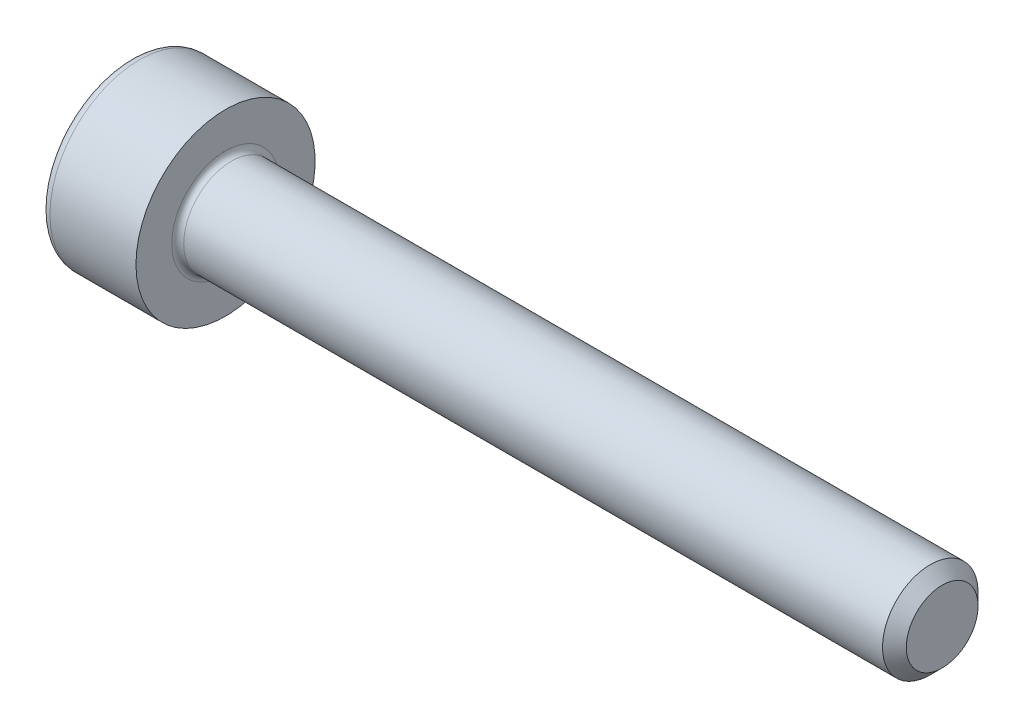
ISO-10303-21;
HEADER;
FILE_DESCRIPTION(('STEP AP214'),'2;1');
FILE_NAME('part.step','',(''),(''),'','','');
FILE_SCHEMA(('AUTOMOTIVE_DESIGN { 1 0 10303 214 1 1 1 1 }'));
ENDSEC;
DATA;
#1=APPLICATION_CONTEXT('core data for automotive mechanical design processes');
#2=APPLICATION_PROTOCOL_DEFINITION('international standard','automotive_design',2000,#1);
#3=PRODUCT_CONTEXT('',#1,'mechanical');
#4=PRODUCT('Part','Part','',(#3));
#5=PRODUCT_RELATED_PRODUCT_CATEGORY('part','',(#4));
#6=PRODUCT_DEFINITION_FORMATION('','',#4);
#7=PRODUCT_DEFINITION_CONTEXT('part definition',#1,'design');
#8=PRODUCT_DEFINITION('design','',#6,#7);
#9=PRODUCT_DEFINITION_SHAPE('','',#8);
#10=(LENGTH_UNIT() NAMED_UNIT(*) SI_UNIT(.MILLI.,.METRE.));
#11=(NAMED_UNIT(*) PLANE_ANGLE_UNIT() SI_UNIT($,.RADIAN.));
#12=(NAMED_UNIT(*) SI_UNIT($,.STERADIAN.) SOLID_ANGLE_UNIT());
#13=UNCERTAINTY_MEASURE_WITH_UNIT(LENGTH_MEASURE(1.E-05),#10,'distance_accuracy_value','');
#14=(GEOMETRIC_REPRESENTATION_CONTEXT(3) GLOBAL_UNCERTAINTY_ASSIGNED_CONTEXT((#13)) GLOBAL_UNIT_ASSIGNED_CONTEXT((#10,
#11,#12)) REPRESENTATION_CONTEXT('',''));
#15=CARTESIAN_POINT('',(0.,0.,0.));
#16=DIRECTION('',(0.,0.,1.));
#17=DIRECTION('',(1.,0.,0.));
#18=AXIS2_PLACEMENT_3D('',#15,#16,#17);
#19=CARTESIAN_POINT('',(0.,0.,0.));
#20=DIRECTION('',(-1.,0.,0.));
#21=DIRECTION('',(0.,0.,1.));
#22=AXIS2_PLACEMENT_3D('',#19,#20,#21);
#23=PLANE('',#22);
#24=DIRECTION('',(0.,-0.499999999999998,0.866025403784439));
#25=VECTOR('',#24,1.);
#26=CARTESIAN_POINT('',(0.,0.877572409168226,0.));
#27=LINE('',#26,#25);
#28=CARTESIAN_POINT('',(0.,0.877572409168226,0.));
#29=VERTEX_POINT('',#28);
#30=CARTESIAN_POINT('',(0.,0.438786204584112,0.759999999999998));
#31=VERTEX_POINT('',#30);
#32=EDGE_CURVE('E259',#29,#31,#27,.T.);
#33=ORIENTED_EDGE('',*,*,#32,.T.);
#34=DIRECTION('',(0.,1.,0.));
#35=VECTOR('',#34,1.);
#36=CARTESIAN_POINT('',(0.,-0.43878620458412,0.76));
#37=LINE('',#36,#35);
#38=CARTESIAN_POINT('',(0.,-0.43878620458412,0.76));
#39=VERTEX_POINT('',#38);
#40=EDGE_CURVE('E131',#39,#31,#37,.T.);
#41=ORIENTED_EDGE('',*,*,#40,.F.);
#42=DIRECTION('',(0.,-0.500000000000001,-0.866025403784438));
#43=VECTOR('',#42,1.);
#44=CARTESIAN_POINT('',(0.,-0.43878620458412,0.76));
#45=LINE('',#44,#43);
#46=CARTESIAN_POINT('',(0.,-0.877572409168237,0.));
#47=VERTEX_POINT('',#46);
#48=EDGE_CURVE('E262',#39,#47,#45,.T.);
#49=ORIENTED_EDGE('',*,*,#48,.T.);
#50=DIRECTION('',(0.,0.499999999999998,-0.866025403784439));
#51=VECTOR('',#50,1.);
#52=CARTESIAN_POINT('',(0.,-0.877572409168237,0.));
#53=LINE('',#52,#51);
#54=CARTESIAN_POINT('',(0.,-0.438786204584122,-0.760000000000002));
#55=VERTEX_POINT('',#54);
#56=EDGE_CURVE('E265',#47,#55,#53,.T.);
#57=ORIENTED_EDGE('',*,*,#56,.T.);
#58=DIRECTION('',(0.,-1.,0.));
#59=VECTOR('',#58,1.);
#60=CARTESIAN_POINT('',(0.,0.438786204584109,-0.760000000000003));
#61=LINE('',#60,#59);
#62=CARTESIAN_POINT('',(0.,0.438786204584109,-0.760000000000003));
#63=VERTEX_POINT('',#62);
#64=EDGE_CURVE('E268',#63,#55,#61,.T.);
#65=ORIENTED_EDGE('',*,*,#64,.F.);
#66=DIRECTION('',(0.,-0.500000000000001,-0.866025403784438));
#67=VECTOR('',#66,1.);
#68=CARTESIAN_POINT('',(0.,0.877572409168226,0.));
#69=LINE('',#68,#67);
#70=EDGE_CURVE('E126',#29,#63,#69,.T.);
#71=ORIENTED_EDGE('',*,*,#70,.F.);
#72=EDGE_LOOP('',(#33,#41,#49,#57,#65,#71));
#73=FACE_BOUND('',#72,.T.);
#74=CARTESIAN_POINT('',(0.,0.,0.));
#75=DIRECTION('',(-1.,0.,0.));
#76=DIRECTION('',(0.,0.,1.));
#77=AXIS2_PLACEMENT_3D('',#74,#75,#76);
#78=CIRCLE('',#77,1.34);
#79=CARTESIAN_POINT('',(0.,0.,1.34));
#80=VERTEX_POINT('',#79);
#81=EDGE_CURVE('E43',#80,#80,#78,.T.);
#82=ORIENTED_EDGE('',*,*,#81,.T.);
#83=EDGE_LOOP('',(#82));
#84=FACE_BOUND('',#83,.T.);
#85=ADVANCED_FACE('F35',(#73,#84),#23,.T.);
#86=CARTESIAN_POINT('',(-31.75,0.,0.));
#87=DIRECTION('',(-1.,0.,0.));
#88=DIRECTION('',(0.,0.,1.));
#89=AXIS2_PLACEMENT_3D('',#86,#87,#88);
#90=CYLINDRICAL_SURFACE('',#89,1.5);
#91=CARTESIAN_POINT('',(0.16,0.,0.));
#92=DIRECTION('',(-1.,0.,0.));
#93=DIRECTION('',(0.,0.,1.));
#94=AXIS2_PLACEMENT_3D('',#91,#92,#93);
#95=CIRCLE('',#94,1.5);
#96=CARTESIAN_POINT('',(0.16,0.,1.5));
#97=VERTEX_POINT('',#96);
#98=EDGE_CURVE('E11',#97,#97,#95,.F.);
#99=ORIENTED_EDGE('',*,*,#98,.T.);
#100=EDGE_LOOP('',(#99));
#101=FACE_BOUND('',#100,.T.);
#102=CARTESIAN_POINT('',(1.6,0.,0.));
#103=DIRECTION('',(-1.,0.,0.));
#104=DIRECTION('',(0.,0.,1.));
#105=AXIS2_PLACEMENT_3D('',#102,#103,#104);
#106=CIRCLE('',#105,1.5);
#107=CARTESIAN_POINT('',(1.6,0.,1.5));
#108=VERTEX_POINT('',#107);
#109=EDGE_CURVE('E149',#108,#108,#106,.T.);
#110=ORIENTED_EDGE('',*,*,#109,.T.);
#111=EDGE_LOOP('',(#110));
#112=FACE_BOUND('',#111,.T.);
#113=ADVANCED_FACE('F173',(#101,#112),#90,.T.);
#114=CARTESIAN_POINT('',(1.6,1.5,0.));
#115=DIRECTION('',(1.,0.,0.));
#116=DIRECTION('',(0.,0.,-1.));
#117=AXIS2_PLACEMENT_3D('',#114,#115,#116);
#118=PLANE('',#117);
#119=CARTESIAN_POINT('',(1.6,0.,0.));
#120=DIRECTION('',(1.,0.,0.));
#121=DIRECTION('',(0.,0.,-1.));
#122=AXIS2_PLACEMENT_3D('',#119,#120,#121);
#123=CIRCLE('',#122,0.899999999999999);
#124=CARTESIAN_POINT('',(1.6,0.,-0.899999999999999));
#125=VERTEX_POINT('',#124);
#126=EDGE_CURVE('E152',#125,#125,#123,.F.);
#127=ORIENTED_EDGE('',*,*,#126,.T.);
#128=EDGE_LOOP('',(#127));
#129=FACE_BOUND('',#128,.T.);
#130=ORIENTED_EDGE('',*,*,#109,.F.);
#131=EDGE_LOOP('',(#130));
#132=FACE_BOUND('',#131,.T.);
#133=ADVANCED_FACE('F179',(#129,#132),#118,.T.);
#134=CARTESIAN_POINT('',(-31.75,0.,0.));
#135=DIRECTION('',(-1.,0.,0.));
#136=DIRECTION('',(0.,0.,1.));
#137=AXIS2_PLACEMENT_3D('',#134,#135,#136);
#138=CYLINDRICAL_SURFACE('',#137,0.799999999999999);
#139=CARTESIAN_POINT('',(1.7,0.,0.));
#140=DIRECTION('',(1.,0.,0.));
#141=DIRECTION('',(0.,0.,-1.));
#142=AXIS2_PLACEMENT_3D('',#139,#140,#141);
#143=CIRCLE('',#142,0.799999999999999);
#144=CARTESIAN_POINT('',(1.7,0.,-0.799999999999999));
#145=VERTEX_POINT('',#144);
#146=EDGE_CURVE('E155',#145,#145,#143,.T.);
#147=ORIENTED_EDGE('',*,*,#146,.T.);
#148=EDGE_LOOP('',(#147));
#149=FACE_BOUND('',#148,.T.);
#150=CARTESIAN_POINT('',(13.401,0.,0.));
#151=DIRECTION('',(-1.,0.,0.));
#152=DIRECTION('',(0.,0.,1.));
#153=AXIS2_PLACEMENT_3D('',#150,#151,#152);
#154=CIRCLE('',#153,0.799999999999998);
#155=CARTESIAN_POINT('',(13.401,0.,0.799999999999998));
#156=VERTEX_POINT('',#155);
#157=EDGE_CURVE('E146',#156,#156,#154,.T.);
#158=ORIENTED_EDGE('',*,*,#157,.T.);
#159=EDGE_LOOP('',(#158));
#160=FACE_BOUND('',#159,.T.);
#161=ADVANCED_FACE('F185',(#149,#160),#138,.T.);
#162=CARTESIAN_POINT('',(13.6,0.,0.));
#163=DIRECTION('',(-1.,0.,0.));
#164=DIRECTION('',(0.,0.,1.));
#165=AXIS2_PLACEMENT_3D('',#162,#163,#164);
#166=CONICAL_SURFACE('',#165,0.601,0.785398163397432);
#167=ORIENTED_EDGE('',*,*,#157,.F.);
#168=EDGE_LOOP('',(#167));
#169=FACE_BOUND('',#168,.T.);
#170=CARTESIAN_POINT('',(13.6,0.,0.));
#171=DIRECTION('',(-1.,0.,0.));
#172=DIRECTION('',(0.,0.,1.));
#173=AXIS2_PLACEMENT_3D('',#170,#171,#172);
#174=CIRCLE('',#173,0.601);
#175=CARTESIAN_POINT('',(13.6,0.,0.601));
#176=VERTEX_POINT('',#175);
#177=EDGE_CURVE('E142',#176,#176,#174,.T.);
#178=ORIENTED_EDGE('',*,*,#177,.T.);
#179=EDGE_LOOP('',(#178));
#180=FACE_BOUND('',#179,.T.);
#181=ADVANCED_FACE('F189',(#169,#180),#166,.T.);
#182=CARTESIAN_POINT('',(13.6,0.601,0.));
#183=DIRECTION('',(1.,0.,0.));
#184=DIRECTION('',(0.,0.,-1.));
#185=AXIS2_PLACEMENT_3D('',#182,#183,#184);
#186=PLANE('',#185);
#187=ORIENTED_EDGE('',*,*,#177,.F.);
#188=EDGE_LOOP('',(#187));
#189=FACE_BOUND('',#188,.T.);
#190=ADVANCED_FACE('F169',(#189),#186,.T.);
#191=CARTESIAN_POINT('',(1.7,0.,0.));
#192=DIRECTION('',(1.,0.,0.));
#193=DIRECTION('',(0.,0.,-1.));
#194=AXIS2_PLACEMENT_3D('',#191,#192,#193);
#195=TOROIDAL_SURFACE('',#194,0.899999999999999,0.1);
#196=ORIENTED_EDGE('',*,*,#146,.F.);
#197=EDGE_LOOP('',(#196));
#198=FACE_BOUND('',#197,.T.);
#199=ORIENTED_EDGE('',*,*,#126,.F.);
#200=EDGE_LOOP('',(#199));
#201=FACE_BOUND('',#200,.T.);
#202=ADVANCED_FACE('F162',(#198,#201),#195,.F.);
#203=CARTESIAN_POINT('',(0.16,0.,0.));
#204=DIRECTION('',(-1.,0.,0.));
#205=DIRECTION('',(0.,0.,1.));
#206=AXIS2_PLACEMENT_3D('',#203,#204,#205);
#207=TOROIDAL_SURFACE('',#206,1.34,0.16);
#208=ORIENTED_EDGE('',*,*,#98,.F.);
#209=EDGE_LOOP('',(#208));
#210=FACE_BOUND('',#209,.T.);
#211=ORIENTED_EDGE('',*,*,#81,.F.);
#212=EDGE_LOOP('',(#211));
#213=FACE_BOUND('',#212,.T.);
#214=ADVANCED_FACE('F37',(#210,#213),#207,.T.);
#215=CARTESIAN_POINT('',(0.7,0.877572409168226,0.));
#216=DIRECTION('',(0.,-0.86602540378444,-0.499999999999998));
#217=DIRECTION('',(0.,0.499999999999998,-0.86602540378444));
#218=AXIS2_PLACEMENT_3D('',#215,#216,#217);
#219=PLANE('',#218);
#220=ORIENTED_EDGE('',*,*,#32,.F.);
#221=DIRECTION('',(-1.,0.,0.));
#222=VECTOR('',#221,1.);
#223=CARTESIAN_POINT('',(0.7,0.877572409168226,0.));
#224=LINE('',#223,#222);
#225=CARTESIAN_POINT('',(0.7,0.877572409168226,0.));
#226=VERTEX_POINT('',#225);
#227=EDGE_CURVE('E249',#226,#29,#224,.T.);
#228=ORIENTED_EDGE('',*,*,#227,.F.);
#229=DIRECTION('',(0.,-0.499999999999998,0.866025403784439));
#230=VECTOR('',#229,1.);
#231=CARTESIAN_POINT('',(0.7,0.877572409168226,0.));
#232=LINE('',#231,#230);
#233=CARTESIAN_POINT('',(0.7,0.65817930687617,0.379999999999996));
#234=VERTEX_POINT('',#233);
#235=EDGE_CURVE('E118',#226,#234,#232,.T.);
#236=ORIENTED_EDGE('',*,*,#235,.T.);
#237=CARTESIAN_POINT('',(0.7,0.438786204584112,0.759999999999998));
#238=VERTEX_POINT('',#237);
#239=EDGE_CURVE('E109',#234,#238,#232,.T.);
#240=ORIENTED_EDGE('',*,*,#239,.T.);
#241=DIRECTION('',(-1.,0.,0.));
#242=VECTOR('',#241,1.);
#243=CARTESIAN_POINT('',(0.7,0.438786204584112,0.759999999999998));
#244=LINE('',#243,#242);
#245=EDGE_CURVE('E123',#238,#31,#244,.T.);
#246=ORIENTED_EDGE('',*,*,#245,.T.);
#247=EDGE_LOOP('',(#220,#228,#236,#240,#246));
#248=FACE_BOUND('',#247,.T.);
#249=ADVANCED_FACE('F122',(#248),#219,.T.);
#250=CARTESIAN_POINT('',(0.7,-0.43878620458412,0.76));
#251=DIRECTION('',(0.,0.,1.));
#252=DIRECTION('',(0.,-1.,0.));
#253=AXIS2_PLACEMENT_3D('',#250,#251,#252);
#254=PLANE('',#253);
#255=ORIENTED_EDGE('',*,*,#40,.T.);
#256=ORIENTED_EDGE('',*,*,#245,.F.);
#257=DIRECTION('',(0.,1.,0.));
#258=VECTOR('',#257,1.);
#259=CARTESIAN_POINT('',(0.7,-0.43878620458412,0.76));
#260=LINE('',#259,#258);
#261=CARTESIAN_POINT('',(0.7,0.,0.759999999999999));
#262=VERTEX_POINT('',#261);
#263=EDGE_CURVE('E106',#262,#238,#260,.T.);
#264=ORIENTED_EDGE('',*,*,#263,.F.);
#265=CARTESIAN_POINT('',(0.7,-0.43878620458412,0.76));
#266=VERTEX_POINT('',#265);
#267=EDGE_CURVE('E117',#266,#262,#260,.T.);
#268=ORIENTED_EDGE('',*,*,#267,.F.);
#269=DIRECTION('',(-1.,0.,0.));
#270=VECTOR('',#269,1.);
#271=CARTESIAN_POINT('',(0.7,-0.43878620458412,0.76));
#272=LINE('',#271,#270);
#273=EDGE_CURVE('E133',#266,#39,#272,.T.);
#274=ORIENTED_EDGE('',*,*,#273,.T.);
#275=EDGE_LOOP('',(#255,#256,#264,#268,#274));
#276=FACE_BOUND('',#275,.T.);
#277=ADVANCED_FACE('F128',(#276),#254,.F.);
#278=CARTESIAN_POINT('',(0.7,-0.43878620458412,0.76));
#279=DIRECTION('',(0.,0.866025403784438,-0.500000000000001));
#280=DIRECTION('',(0.,0.500000000000001,0.866025403784438));
#281=AXIS2_PLACEMENT_3D('',#278,#279,#280);
#282=PLANE('',#281);
#283=ORIENTED_EDGE('',*,*,#48,.F.);
#284=ORIENTED_EDGE('',*,*,#273,.F.);
#285=DIRECTION('',(0.,-0.500000000000001,-0.866025403784438));
#286=VECTOR('',#285,1.);
#287=CARTESIAN_POINT('',(0.7,-0.43878620458412,0.76));
#288=LINE('',#287,#286);
#289=CARTESIAN_POINT('',(0.7,-0.658179306876177,0.380000000000003));
#290=VERTEX_POINT('',#289);
#291=EDGE_CURVE('E288',#266,#290,#288,.T.);
#292=ORIENTED_EDGE('',*,*,#291,.T.);
#293=CARTESIAN_POINT('',(0.7,-0.877572409168237,0.));
#294=VERTEX_POINT('',#293);
#295=EDGE_CURVE('E277',#290,#294,#288,.T.);
#296=ORIENTED_EDGE('',*,*,#295,.T.);
#297=DIRECTION('',(-1.,0.,0.));
#298=VECTOR('',#297,1.);
#299=CARTESIAN_POINT('',(0.7,-0.877572409168237,0.));
#300=LINE('',#299,#298);
#301=EDGE_CURVE('E138',#294,#47,#300,.T.);
#302=ORIENTED_EDGE('',*,*,#301,.T.);
#303=EDGE_LOOP('',(#283,#284,#292,#296,#302));
#304=FACE_BOUND('',#303,.T.);
#305=ADVANCED_FACE('F203',(#304),#282,.T.);
#306=CARTESIAN_POINT('',(0.7,-0.877572409168237,0.));
#307=DIRECTION('',(0.,0.86602540378444,0.499999999999998));
#308=DIRECTION('',(0.,-0.499999999999998,0.86602540378444));
#309=AXIS2_PLACEMENT_3D('',#306,#307,#308);
#310=PLANE('',#309);
#311=ORIENTED_EDGE('',*,*,#56,.F.);
#312=ORIENTED_EDGE('',*,*,#301,.F.);
#313=DIRECTION('',(0.,0.499999999999998,-0.866025403784439));
#314=VECTOR('',#313,1.);
#315=CARTESIAN_POINT('',(0.7,-0.877572409168237,0.));
#316=LINE('',#315,#314);
#317=CARTESIAN_POINT('',(0.7,-0.658179306876179,-0.380000000000002));
#318=VERTEX_POINT('',#317);
#319=EDGE_CURVE('E255',#294,#318,#316,.T.);
#320=ORIENTED_EDGE('',*,*,#319,.T.);
#321=CARTESIAN_POINT('',(0.7,-0.438786204584122,-0.760000000000002));
#322=VERTEX_POINT('',#321);
#323=EDGE_CURVE('E287',#318,#322,#316,.T.);
#324=ORIENTED_EDGE('',*,*,#323,.T.);
#325=DIRECTION('',(-1.,0.,0.));
#326=VECTOR('',#325,1.);
#327=CARTESIAN_POINT('',(0.7,-0.438786204584122,-0.760000000000002));
#328=LINE('',#327,#326);
#329=EDGE_CURVE('E248',#322,#55,#328,.T.);
#330=ORIENTED_EDGE('',*,*,#329,.T.);
#331=EDGE_LOOP('',(#311,#312,#320,#324,#330));
#332=FACE_BOUND('',#331,.T.);
#333=ADVANCED_FACE('F206',(#332),#310,.T.);
#334=CARTESIAN_POINT('',(0.7,0.438786204584109,-0.760000000000003));
#335=DIRECTION('',(0.,0.,-1.));
#336=DIRECTION('',(0.,1.,0.));
#337=AXIS2_PLACEMENT_3D('',#334,#335,#336);
#338=PLANE('',#337);
#339=ORIENTED_EDGE('',*,*,#64,.T.);
#340=ORIENTED_EDGE('',*,*,#329,.F.);
#341=DIRECTION('',(0.,-1.,0.));
#342=VECTOR('',#341,1.);
#343=CARTESIAN_POINT('',(0.7,0.438786204584109,-0.760000000000003));
#344=LINE('',#343,#342);
#345=CARTESIAN_POINT('',(0.7,0.,-0.76));
#346=VERTEX_POINT('',#345);
#347=EDGE_CURVE('E252',#346,#322,#344,.T.);
#348=ORIENTED_EDGE('',*,*,#347,.F.);
#349=CARTESIAN_POINT('',(0.7,0.438786204584109,-0.760000000000003));
#350=VERTEX_POINT('',#349);
#351=EDGE_CURVE('E50',#350,#346,#344,.T.);
#352=ORIENTED_EDGE('',*,*,#351,.F.);
#353=DIRECTION('',(-1.,0.,0.));
#354=VECTOR('',#353,1.);
#355=CARTESIAN_POINT('',(0.7,0.438786204584109,-0.760000000000003));
#356=LINE('',#355,#354);
#357=EDGE_CURVE('E245',#350,#63,#356,.T.);
#358=ORIENTED_EDGE('',*,*,#357,.T.);
#359=EDGE_LOOP('',(#339,#340,#348,#352,#358));
#360=FACE_BOUND('',#359,.T.);
#361=ADVANCED_FACE('F210',(#360),#338,.F.);
#362=CARTESIAN_POINT('',(0.7,0.877572409168226,0.));
#363=DIRECTION('',(0.,0.866025403784438,-0.500000000000001));
#364=DIRECTION('',(0.,0.500000000000001,0.866025403784438));
#365=AXIS2_PLACEMENT_3D('',#362,#363,#364);
#366=PLANE('',#365);
#367=ORIENTED_EDGE('',*,*,#70,.T.);
#368=ORIENTED_EDGE('',*,*,#357,.F.);
#369=DIRECTION('',(0.,-0.500000000000001,-0.866025403784438));
#370=VECTOR('',#369,1.);
#371=CARTESIAN_POINT('',(0.7,0.877572409168226,0.));
#372=LINE('',#371,#370);
#373=CARTESIAN_POINT('',(0.7,0.65817930687617,-0.379999999999999));
#374=VERTEX_POINT('',#373);
#375=EDGE_CURVE('E235',#374,#350,#372,.T.);
#376=ORIENTED_EDGE('',*,*,#375,.F.);
#377=EDGE_CURVE('E241',#226,#374,#372,.T.);
#378=ORIENTED_EDGE('',*,*,#377,.F.);
#379=ORIENTED_EDGE('',*,*,#227,.T.);
#380=EDGE_LOOP('',(#367,#368,#376,#378,#379));
#381=FACE_BOUND('',#380,.T.);
#382=ADVANCED_FACE('F214',(#381),#366,.F.);
#383=CARTESIAN_POINT('',(0.7,1.31635861375234,-0.760000000000004));
#384=DIRECTION('',(1.,0.,0.));
#385=DIRECTION('',(0.,0.,-1.));
#386=AXIS2_PLACEMENT_3D('',#383,#384,#385);
#387=PLANE('',#386);
#388=ORIENTED_EDGE('',*,*,#347,.T.);
#389=ORIENTED_EDGE('',*,*,#323,.F.);
#390=CARTESIAN_POINT('',(0.7,0.,0.));
#391=DIRECTION('',(-1.,0.,0.));
#392=DIRECTION('',(0.,0.,1.));
#393=AXIS2_PLACEMENT_3D('',#390,#391,#392);
#394=CIRCLE('',#393,0.76);
#395=EDGE_CURVE('E283',#346,#318,#394,.T.);
#396=ORIENTED_EDGE('',*,*,#395,.F.);
#397=EDGE_LOOP('',(#388,#389,#396));
#398=FACE_BOUND('',#397,.T.);
#399=ADVANCED_FACE('F218',(#398),#387,.F.);
#400=ORIENTED_EDGE('',*,*,#319,.F.);
#401=ORIENTED_EDGE('',*,*,#295,.F.);
#402=EDGE_CURVE('E136',#318,#290,#394,.T.);
#403=ORIENTED_EDGE('',*,*,#402,.F.);
#404=EDGE_LOOP('',(#400,#401,#403));
#405=FACE_BOUND('',#404,.T.);
#406=ADVANCED_FACE('F221',(#405),#387,.F.);
#407=ORIENTED_EDGE('',*,*,#291,.F.);
#408=ORIENTED_EDGE('',*,*,#267,.T.);
#409=EDGE_CURVE('E132',#290,#262,#394,.T.);
#410=ORIENTED_EDGE('',*,*,#409,.F.);
#411=EDGE_LOOP('',(#407,#408,#410));
#412=FACE_BOUND('',#411,.T.);
#413=ADVANCED_FACE('F226',(#412),#387,.F.);
#414=ORIENTED_EDGE('',*,*,#263,.T.);
#415=ORIENTED_EDGE('',*,*,#239,.F.);
#416=EDGE_CURVE('E112',#262,#234,#394,.T.);
#417=ORIENTED_EDGE('',*,*,#416,.F.);
#418=EDGE_LOOP('',(#414,#415,#417));
#419=FACE_BOUND('',#418,.T.);
#420=ADVANCED_FACE('F108',(#419),#387,.F.);
#421=ORIENTED_EDGE('',*,*,#235,.F.);
#422=ORIENTED_EDGE('',*,*,#377,.T.);
#423=EDGE_CURVE('E143',#234,#374,#394,.T.);
#424=ORIENTED_EDGE('',*,*,#423,.F.);
#425=EDGE_LOOP('',(#421,#422,#424));
#426=FACE_BOUND('',#425,.T.);
#427=ADVANCED_FACE('F229',(#426),#387,.F.);
#428=ORIENTED_EDGE('',*,*,#375,.T.);
#429=ORIENTED_EDGE('',*,*,#351,.T.);
#430=EDGE_CURVE('E238',#374,#346,#394,.T.);
#431=ORIENTED_EDGE('',*,*,#430,.F.);
#432=EDGE_LOOP('',(#428,#429,#431));
#433=FACE_BOUND('',#432,.T.);
#434=ADVANCED_FACE('F199',(#433),#387,.F.);
#435=CARTESIAN_POINT('',(0.7,0.,0.));
#436=DIRECTION('',(-1.,0.,0.));
#437=DIRECTION('',(0.,0.,1.));
#438=AXIS2_PLACEMENT_3D('',#435,#436,#437);
#439=CONICAL_SURFACE('',#438,0.76,1.0471975511966);
#440=CARTESIAN_POINT('',(1.13878620458412,0.,0.));
#441=VERTEX_POINT('',#440);
#442=VERTEX_LOOP('',#441);
#443=FACE_BOUND('',#442,.T.);
#444=ORIENTED_EDGE('',*,*,#416,.T.);
#445=ORIENTED_EDGE('',*,*,#423,.T.);
#446=ORIENTED_EDGE('',*,*,#430,.T.);
#447=ORIENTED_EDGE('',*,*,#395,.T.);
#448=ORIENTED_EDGE('',*,*,#402,.T.);
#449=ORIENTED_EDGE('',*,*,#409,.T.);
#450=EDGE_LOOP('',(#444,#445,#446,#447,#448,#449));
#451=FACE_BOUND('',#450,.T.);
#452=ADVANCED_FACE('F197',(#443,#451),#439,.F.);
#453=CLOSED_SHELL('',(#85,#113,#133,#161,#181,#190,#202,#214,#249,#277,#305,#333,#361,#382,#399,
#406,#413,#420,#427,#434,#452));
#454=MANIFOLD_SOLID_BREP('B2',#453);
#455=ADVANCED_BREP_SHAPE_REPRESENTATION('',(#18,#454),#14);
#456=SHAPE_DEFINITION_REPRESENTATION(#9,#455);
ENDSEC;
END-ISO-10303-21;
